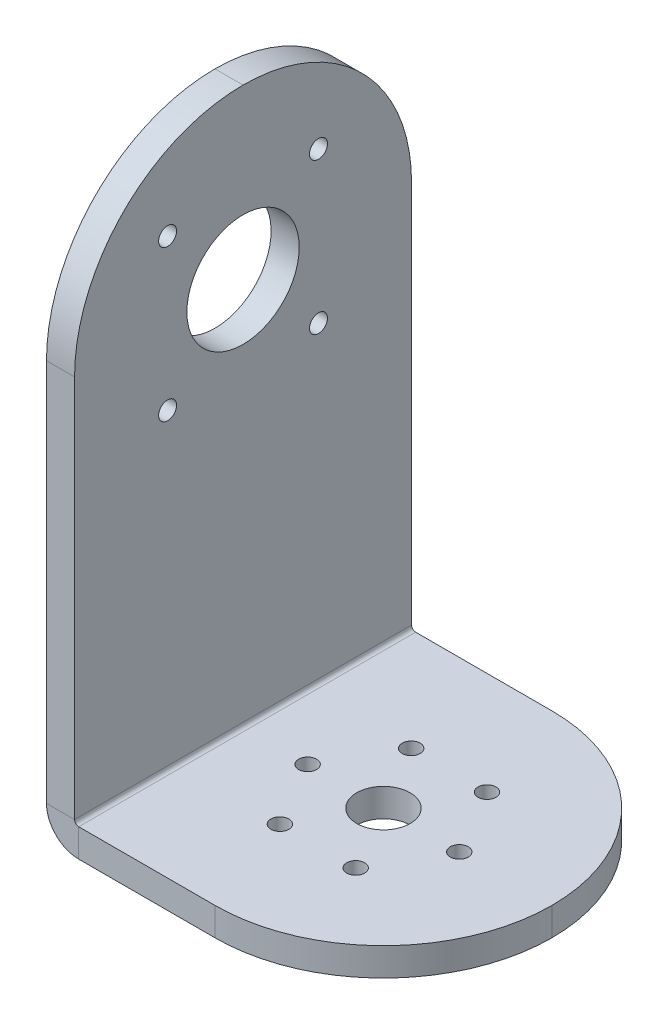
ISO-10303-21;
HEADER;
FILE_DESCRIPTION(('STEP AP214'),'2;1');
FILE_NAME('part.step','',(''),(''),'','','');
FILE_SCHEMA(('AUTOMOTIVE_DESIGN { 1 0 10303 214 1 1 1 1 }'));
ENDSEC;
DATA;
#1=APPLICATION_CONTEXT('core data for automotive mechanical design processes');
#2=APPLICATION_PROTOCOL_DEFINITION('international standard','automotive_design',2000,#1);
#3=PRODUCT_CONTEXT('',#1,'mechanical');
#4=PRODUCT('Part','Part','',(#3));
#5=PRODUCT_RELATED_PRODUCT_CATEGORY('part','',(#4));
#6=PRODUCT_DEFINITION_FORMATION('','',#4);
#7=PRODUCT_DEFINITION_CONTEXT('part definition',#1,'design');
#8=PRODUCT_DEFINITION('design','',#6,#7);
#9=PRODUCT_DEFINITION_SHAPE('','',#8);
#10=(LENGTH_UNIT() NAMED_UNIT(*) SI_UNIT(.MILLI.,.METRE.));
#11=(NAMED_UNIT(*) PLANE_ANGLE_UNIT() SI_UNIT($,.RADIAN.));
#12=(NAMED_UNIT(*) SI_UNIT($,.STERADIAN.) SOLID_ANGLE_UNIT());
#13=UNCERTAINTY_MEASURE_WITH_UNIT(LENGTH_MEASURE(1.E-05),#10,'distance_accuracy_value','');
#14=(GEOMETRIC_REPRESENTATION_CONTEXT(3) GLOBAL_UNCERTAINTY_ASSIGNED_CONTEXT((#13)) GLOBAL_UNIT_ASSIGNED_CONTEXT((#10,
#11,#12)) REPRESENTATION_CONTEXT('',''));
#15=CARTESIAN_POINT('',(0.,0.,0.));
#16=DIRECTION('',(0.,0.,1.));
#17=DIRECTION('',(1.,0.,0.));
#18=AXIS2_PLACEMENT_3D('',#15,#16,#17);
#19=CARTESIAN_POINT('',(0.,104.,30.));
#20=DIRECTION('',(1.,0.,0.));
#21=DIRECTION('',(0.,1.,0.));
#22=AXIS2_PLACEMENT_3D('',#19,#20,#21);
#23=PLANE('',#22);
#24=CARTESIAN_POINT('',(0.,87.4350288425444,-13.4350288425444));
#25=DIRECTION('',(-1.,0.,0.));
#26=DIRECTION('',(0.,0.,1.));
#27=AXIS2_PLACEMENT_3D('',#24,#25,#26);
#28=CIRCLE('',#27,1.60000000000002);
#29=CARTESIAN_POINT('',(0.,87.4350288425444,-11.8350288425444));
#30=VERTEX_POINT('',#29);
#31=EDGE_CURVE('E362',#30,#30,#28,.T.);
#32=ORIENTED_EDGE('',*,*,#31,.F.);
#33=EDGE_LOOP('',(#32));
#34=FACE_BOUND('',#33,.T.);
#35=CARTESIAN_POINT('',(0.,74.,0.));
#36=DIRECTION('',(-1.,0.,0.));
#37=DIRECTION('',(0.,-1.,0.));
#38=AXIS2_PLACEMENT_3D('',#35,#36,#37);
#39=CIRCLE('',#38,10.);
#40=CARTESIAN_POINT('',(0.,64.,0.));
#41=VERTEX_POINT('',#40);
#42=EDGE_CURVE('E383',#41,#41,#39,.T.);
#43=ORIENTED_EDGE('',*,*,#42,.F.);
#44=EDGE_LOOP('',(#43));
#45=FACE_BOUND('',#44,.T.);
#46=CARTESIAN_POINT('',(0.,74.,0.));
#47=DIRECTION('',(1.,0.,0.));
#48=DIRECTION('',(0.,1.,0.));
#49=AXIS2_PLACEMENT_3D('',#46,#47,#48);
#50=CIRCLE('',#49,30.);
#51=CARTESIAN_POINT('',(0.,74.,30.));
#52=VERTEX_POINT('',#51);
#53=CARTESIAN_POINT('',(0.,104.,0.));
#54=VERTEX_POINT('',#53);
#55=EDGE_CURVE('E61',#52,#54,#50,.F.);
#56=ORIENTED_EDGE('',*,*,#55,.T.);
#57=CARTESIAN_POINT('',(0.,74.,0.));
#58=DIRECTION('',(1.,0.,0.));
#59=DIRECTION('',(0.,1.,0.));
#60=AXIS2_PLACEMENT_3D('',#57,#58,#59);
#61=CIRCLE('',#60,30.);
#62=CARTESIAN_POINT('',(0.,74.,-30.));
#63=VERTEX_POINT('',#62);
#64=EDGE_CURVE('E53',#54,#63,#61,.F.);
#65=ORIENTED_EDGE('',*,*,#64,.T.);
#66=DIRECTION('',(0.,-1.,0.));
#67=VECTOR('',#66,1.);
#68=CARTESIAN_POINT('',(0.,104.,-30.));
#69=LINE('',#68,#67);
#70=CARTESIAN_POINT('',(0.,5.73660000000005,-30.));
#71=VERTEX_POINT('',#70);
#72=EDGE_CURVE('E179',#63,#71,#69,.T.);
#73=ORIENTED_EDGE('',*,*,#72,.T.);
#74=DIRECTION('',(0.,0.,-1.));
#75=VECTOR('',#74,1.);
#76=CARTESIAN_POINT('',(0.,5.73660000000005,30.));
#77=LINE('',#76,#75);
#78=CARTESIAN_POINT('',(0.,5.73660000000005,30.));
#79=VERTEX_POINT('',#78);
#80=EDGE_CURVE('E186',#79,#71,#77,.T.);
#81=ORIENTED_EDGE('',*,*,#80,.F.);
#82=DIRECTION('',(0.,-1.,0.));
#83=VECTOR('',#82,1.);
#84=CARTESIAN_POINT('',(0.,104.,30.));
#85=LINE('',#84,#83);
#86=EDGE_CURVE('E163',#52,#79,#85,.T.);
#87=ORIENTED_EDGE('',*,*,#86,.F.);
#88=EDGE_LOOP('',(#56,#65,#73,#81,#87));
#89=FACE_BOUND('',#88,.T.);
#90=CARTESIAN_POINT('',(0.,60.5649711574556,13.4350288425444));
#91=DIRECTION('',(-1.,0.,0.));
#92=DIRECTION('',(0.,0.,1.));
#93=AXIS2_PLACEMENT_3D('',#90,#91,#92);
#94=CIRCLE('',#93,1.60000000000002);
#95=CARTESIAN_POINT('',(0.,60.5649711574556,15.0350288425444));
#96=VERTEX_POINT('',#95);
#97=EDGE_CURVE('E377',#96,#96,#94,.T.);
#98=ORIENTED_EDGE('',*,*,#97,.F.);
#99=EDGE_LOOP('',(#98));
#100=FACE_BOUND('',#99,.T.);
#101=CARTESIAN_POINT('',(0.,60.5649711574556,-13.4350288425444));
#102=DIRECTION('',(-1.,0.,0.));
#103=DIRECTION('',(0.,0.,1.));
#104=AXIS2_PLACEMENT_3D('',#101,#102,#103);
#105=CIRCLE('',#104,1.60000000000002);
#106=CARTESIAN_POINT('',(0.,60.5649711574556,-11.8350288425444));
#107=VERTEX_POINT('',#106);
#108=EDGE_CURVE('E371',#107,#107,#105,.T.);
#109=ORIENTED_EDGE('',*,*,#108,.F.);
#110=EDGE_LOOP('',(#109));
#111=FACE_BOUND('',#110,.T.);
#112=CARTESIAN_POINT('',(0.,87.4350288425444,13.4350288425444));
#113=DIRECTION('',(-1.,0.,0.));
#114=DIRECTION('',(0.,0.,1.));
#115=AXIS2_PLACEMENT_3D('',#112,#113,#114);
#116=CIRCLE('',#115,1.60000000000002);
#117=CARTESIAN_POINT('',(0.,87.4350288425444,15.0350288425444));
#118=VERTEX_POINT('',#117);
#119=EDGE_CURVE('E358',#118,#118,#116,.T.);
#120=ORIENTED_EDGE('',*,*,#119,.F.);
#121=EDGE_LOOP('',(#120));
#122=FACE_BOUND('',#121,.T.);
#123=ADVANCED_FACE('F44',(#34,#45,#89,#100,#111,#122),#23,.F.);
#124=CARTESIAN_POINT('',(0.,5.73660000000005,30.));
#125=DIRECTION('',(0.,0.,1.));
#126=DIRECTION('',(1.,0.,0.));
#127=AXIS2_PLACEMENT_3D('',#124,#125,#126);
#128=PLANE('',#127);
#129=DIRECTION('',(1.,0.,0.));
#130=VECTOR('',#129,1.);
#131=CARTESIAN_POINT('',(0.,5.73660000000005,30.));
#132=LINE('',#131,#130);
#133=CARTESIAN_POINT('',(5.,5.7366,30.));
#134=VERTEX_POINT('',#133);
#135=EDGE_CURVE('E134',#79,#134,#132,.T.);
#136=ORIENTED_EDGE('',*,*,#135,.F.);
#137=CARTESIAN_POINT('',(5.7366,5.7366,30.));
#138=DIRECTION('',(0.,0.,1.));
#139=DIRECTION('',(1.,0.,0.));
#140=AXIS2_PLACEMENT_3D('',#137,#138,#139);
#141=CIRCLE('',#140,5.7366);
#142=CARTESIAN_POINT('',(5.7366,0.,30.));
#143=VERTEX_POINT('',#142);
#144=EDGE_CURVE('E129',#79,#143,#141,.T.);
#145=ORIENTED_EDGE('',*,*,#144,.T.);
#146=DIRECTION('',(0.,-1.,0.));
#147=VECTOR('',#146,1.);
#148=CARTESIAN_POINT('',(5.7366,5.,30.));
#149=LINE('',#148,#147);
#150=CARTESIAN_POINT('',(5.7366,5.,30.));
#151=VERTEX_POINT('',#150);
#152=EDGE_CURVE('E122',#151,#143,#149,.T.);
#153=ORIENTED_EDGE('',*,*,#152,.F.);
#154=CARTESIAN_POINT('',(5.7366,5.7366,30.));
#155=DIRECTION('',(0.,0.,1.));
#156=DIRECTION('',(1.,0.,0.));
#157=AXIS2_PLACEMENT_3D('',#154,#155,#156);
#158=CIRCLE('',#157,0.7366);
#159=EDGE_CURVE('E127',#134,#151,#158,.T.);
#160=ORIENTED_EDGE('',*,*,#159,.F.);
#161=EDGE_LOOP('',(#136,#145,#153,#160));
#162=FACE_BOUND('',#161,.T.);
#163=ADVANCED_FACE('F125',(#162),#128,.T.);
#164=CARTESIAN_POINT('',(5.7366,5.,30.));
#165=DIRECTION('',(0.,0.,1.));
#166=DIRECTION('',(1.,0.,0.));
#167=AXIS2_PLACEMENT_3D('',#164,#165,#166);
#168=PLANE('',#167);
#169=DIRECTION('',(0.,-1.,0.));
#170=VECTOR('',#169,1.);
#171=CARTESIAN_POINT('',(5.,104.,30.));
#172=LINE('',#171,#170);
#173=CARTESIAN_POINT('',(5.,74.,30.));
#174=VERTEX_POINT('',#173);
#175=EDGE_CURVE('E161',#174,#134,#172,.T.);
#176=ORIENTED_EDGE('',*,*,#175,.F.);
#177=DIRECTION('',(1.,0.,0.));
#178=VECTOR('',#177,1.);
#179=CARTESIAN_POINT('',(5.7366,74.,30.));
#180=LINE('',#179,#178);
#181=EDGE_CURVE('E11',#174,#52,#180,.F.);
#182=ORIENTED_EDGE('',*,*,#181,.T.);
#183=ORIENTED_EDGE('',*,*,#86,.T.);
#184=ORIENTED_EDGE('',*,*,#135,.T.);
#185=EDGE_LOOP('',(#176,#182,#183,#184));
#186=FACE_BOUND('',#185,.T.);
#187=ADVANCED_FACE('F256',(#186),#168,.T.);
#188=CARTESIAN_POINT('',(5.7366,0.,-30.));
#189=DIRECTION('',(0.,0.,-1.));
#190=DIRECTION('',(-1.,0.,0.));
#191=AXIS2_PLACEMENT_3D('',#188,#189,#190);
#192=PLANE('',#191);
#193=DIRECTION('',(0.,1.,0.));
#194=VECTOR('',#193,1.);
#195=CARTESIAN_POINT('',(5.7366,0.,-30.));
#196=LINE('',#195,#194);
#197=CARTESIAN_POINT('',(5.7366,0.,-30.));
#198=VERTEX_POINT('',#197);
#199=CARTESIAN_POINT('',(5.7366,5.,-30.));
#200=VERTEX_POINT('',#199);
#201=EDGE_CURVE('E135',#198,#200,#196,.T.);
#202=ORIENTED_EDGE('',*,*,#201,.F.);
#203=CARTESIAN_POINT('',(5.7366,5.7366,-30.));
#204=DIRECTION('',(0.,0.,1.));
#205=DIRECTION('',(1.,0.,0.));
#206=AXIS2_PLACEMENT_3D('',#203,#204,#205);
#207=CIRCLE('',#206,5.7366);
#208=EDGE_CURVE('E181',#71,#198,#207,.T.);
#209=ORIENTED_EDGE('',*,*,#208,.F.);
#210=DIRECTION('',(-1.,0.,0.));
#211=VECTOR('',#210,1.);
#212=CARTESIAN_POINT('',(5.,5.7366,-30.));
#213=LINE('',#212,#211);
#214=CARTESIAN_POINT('',(5.,5.7366,-30.));
#215=VERTEX_POINT('',#214);
#216=EDGE_CURVE('E150',#215,#71,#213,.T.);
#217=ORIENTED_EDGE('',*,*,#216,.F.);
#218=CARTESIAN_POINT('',(5.7366,5.7366,-30.));
#219=DIRECTION('',(0.,0.,1.));
#220=DIRECTION('',(1.,0.,0.));
#221=AXIS2_PLACEMENT_3D('',#218,#219,#220);
#222=CIRCLE('',#221,0.7366);
#223=EDGE_CURVE('E175',#215,#200,#222,.T.);
#224=ORIENTED_EDGE('',*,*,#223,.T.);
#225=EDGE_LOOP('',(#202,#209,#217,#224));
#226=FACE_BOUND('',#225,.T.);
#227=ADVANCED_FACE('F249',(#226),#192,.T.);
#228=CARTESIAN_POINT('',(5.,5.7366,-30.));
#229=DIRECTION('',(0.,0.,-1.));
#230=DIRECTION('',(-1.,0.,0.));
#231=AXIS2_PLACEMENT_3D('',#228,#229,#230);
#232=PLANE('',#231);
#233=DIRECTION('',(1.,0.,0.));
#234=VECTOR('',#233,1.);
#235=CARTESIAN_POINT('',(60.,5.,-30.));
#236=LINE('',#235,#234);
#237=CARTESIAN_POINT('',(30.,5.,-30.));
#238=VERTEX_POINT('',#237);
#239=EDGE_CURVE('E146',#200,#238,#236,.T.);
#240=ORIENTED_EDGE('',*,*,#239,.T.);
#241=DIRECTION('',(0.,-1.,0.));
#242=VECTOR('',#241,1.);
#243=CARTESIAN_POINT('',(30.,5.7366,-30.));
#244=LINE('',#243,#242);
#245=CARTESIAN_POINT('',(30.,0.,-30.));
#246=VERTEX_POINT('',#245);
#247=EDGE_CURVE('E195',#238,#246,#244,.T.);
#248=ORIENTED_EDGE('',*,*,#247,.T.);
#249=DIRECTION('',(1.,0.,0.));
#250=VECTOR('',#249,1.);
#251=CARTESIAN_POINT('',(60.,0.,-30.));
#252=LINE('',#251,#250);
#253=EDGE_CURVE('E170',#198,#246,#252,.T.);
#254=ORIENTED_EDGE('',*,*,#253,.F.);
#255=ORIENTED_EDGE('',*,*,#201,.T.);
#256=EDGE_LOOP('',(#240,#248,#254,#255));
#257=FACE_BOUND('',#256,.T.);
#258=ADVANCED_FACE('F239',(#257),#232,.T.);
#259=CARTESIAN_POINT('',(60.,0.,30.));
#260=DIRECTION('',(0.,1.,0.));
#261=DIRECTION('',(-1.,0.,0.));
#262=AXIS2_PLACEMENT_3D('',#259,#260,#261);
#263=PLANE('',#262);
#264=CARTESIAN_POINT('',(36.75,0.,11.6913429510899));
#265=DIRECTION('',(0.,1.,0.));
#266=DIRECTION('',(-1.,0.,0.));
#267=AXIS2_PLACEMENT_3D('',#264,#265,#266);
#268=CIRCLE('',#267,1.60000000000001);
#269=CARTESIAN_POINT('',(35.15,0.,11.6913429510899));
#270=VERTEX_POINT('',#269);
#271=EDGE_CURVE('E392',#270,#270,#268,.T.);
#272=ORIENTED_EDGE('',*,*,#271,.T.);
#273=EDGE_LOOP('',(#272));
#274=FACE_BOUND('',#273,.T.);
#275=CARTESIAN_POINT('',(43.5,0.,0.));
#276=DIRECTION('',(0.,1.,0.));
#277=DIRECTION('',(-1.,0.,0.));
#278=AXIS2_PLACEMENT_3D('',#275,#276,#277);
#279=CIRCLE('',#278,1.60000000000001);
#280=CARTESIAN_POINT('',(41.9,0.,0.));
#281=VERTEX_POINT('',#280);
#282=EDGE_CURVE('E398',#281,#281,#279,.T.);
#283=ORIENTED_EDGE('',*,*,#282,.T.);
#284=EDGE_LOOP('',(#283));
#285=FACE_BOUND('',#284,.T.);
#286=CARTESIAN_POINT('',(36.75,0.,-11.6913429510899));
#287=DIRECTION('',(0.,1.,0.));
#288=DIRECTION('',(-1.,0.,0.));
#289=AXIS2_PLACEMENT_3D('',#286,#287,#288);
#290=CIRCLE('',#289,1.60000000000001);
#291=CARTESIAN_POINT('',(35.15,0.,-11.6913429510899));
#292=VERTEX_POINT('',#291);
#293=EDGE_CURVE('E404',#292,#292,#290,.T.);
#294=ORIENTED_EDGE('',*,*,#293,.T.);
#295=EDGE_LOOP('',(#294));
#296=FACE_BOUND('',#295,.T.);
#297=CARTESIAN_POINT('',(23.25,0.,-11.6913429510899));
#298=DIRECTION('',(0.,1.,0.));
#299=DIRECTION('',(-1.,0.,0.));
#300=AXIS2_PLACEMENT_3D('',#297,#298,#299);
#301=CIRCLE('',#300,1.60000000000001);
#302=CARTESIAN_POINT('',(21.65,0.,-11.6913429510899));
#303=VERTEX_POINT('',#302);
#304=EDGE_CURVE('E410',#303,#303,#301,.T.);
#305=ORIENTED_EDGE('',*,*,#304,.T.);
#306=EDGE_LOOP('',(#305));
#307=FACE_BOUND('',#306,.T.);
#308=CARTESIAN_POINT('',(16.5,0.,0.));
#309=DIRECTION('',(0.,1.,0.));
#310=DIRECTION('',(-1.,0.,0.));
#311=AXIS2_PLACEMENT_3D('',#308,#309,#310);
#312=CIRCLE('',#311,1.60000000000001);
#313=CARTESIAN_POINT('',(14.9,0.,0.));
#314=VERTEX_POINT('',#313);
#315=EDGE_CURVE('E416',#314,#314,#312,.T.);
#316=ORIENTED_EDGE('',*,*,#315,.T.);
#317=EDGE_LOOP('',(#316));
#318=FACE_BOUND('',#317,.T.);
#319=CARTESIAN_POINT('',(23.25,0.,11.6913429510899));
#320=DIRECTION('',(0.,1.,0.));
#321=DIRECTION('',(-1.,0.,0.));
#322=AXIS2_PLACEMENT_3D('',#319,#320,#321);
#323=CIRCLE('',#322,1.60000000000001);
#324=CARTESIAN_POINT('',(21.65,0.,11.6913429510899));
#325=VERTEX_POINT('',#324);
#326=EDGE_CURVE('E229',#325,#325,#323,.T.);
#327=ORIENTED_EDGE('',*,*,#326,.T.);
#328=EDGE_LOOP('',(#327));
#329=FACE_BOUND('',#328,.T.);
#330=CARTESIAN_POINT('',(30.,0.,0.));
#331=DIRECTION('',(0.,1.,0.));
#332=DIRECTION('',(-1.,0.,0.));
#333=AXIS2_PLACEMENT_3D('',#330,#331,#332);
#334=CIRCLE('',#333,4.75);
#335=CARTESIAN_POINT('',(25.25,0.,0.));
#336=VERTEX_POINT('',#335);
#337=EDGE_CURVE('E220',#336,#336,#334,.T.);
#338=ORIENTED_EDGE('',*,*,#337,.T.);
#339=EDGE_LOOP('',(#338));
#340=FACE_BOUND('',#339,.T.);
#341=ORIENTED_EDGE('',*,*,#253,.T.);
#342=CARTESIAN_POINT('',(30.,0.,0.));
#343=DIRECTION('',(0.,1.,0.));
#344=DIRECTION('',(-1.,0.,0.));
#345=AXIS2_PLACEMENT_3D('',#342,#343,#344);
#346=CIRCLE('',#345,30.);
#347=CARTESIAN_POINT('',(60.,0.,0.));
#348=VERTEX_POINT('',#347);
#349=EDGE_CURVE('E200',#246,#348,#346,.F.);
#350=ORIENTED_EDGE('',*,*,#349,.T.);
#351=CARTESIAN_POINT('',(30.,0.,0.));
#352=DIRECTION('',(0.,1.,0.));
#353=DIRECTION('',(-1.,0.,0.));
#354=AXIS2_PLACEMENT_3D('',#351,#352,#353);
#355=CIRCLE('',#354,30.);
#356=CARTESIAN_POINT('',(30.,0.,30.));
#357=VERTEX_POINT('',#356);
#358=EDGE_CURVE('E198',#348,#357,#355,.F.);
#359=ORIENTED_EDGE('',*,*,#358,.T.);
#360=DIRECTION('',(1.,0.,0.));
#361=VECTOR('',#360,1.);
#362=CARTESIAN_POINT('',(60.,0.,30.));
#363=LINE('',#362,#361);
#364=EDGE_CURVE('E156',#143,#357,#363,.T.);
#365=ORIENTED_EDGE('',*,*,#364,.F.);
#366=DIRECTION('',(0.,0.,-1.));
#367=VECTOR('',#366,1.);
#368=CARTESIAN_POINT('',(5.7366,0.,30.));
#369=LINE('',#368,#367);
#370=EDGE_CURVE('E169',#143,#198,#369,.T.);
#371=ORIENTED_EDGE('',*,*,#370,.T.);
#372=EDGE_LOOP('',(#341,#350,#359,#365,#371));
#373=FACE_BOUND('',#372,.T.);
#374=ADVANCED_FACE('F242',(#274,#285,#296,#307,#318,#329,#340,#373),#263,.F.);
#375=CARTESIAN_POINT('',(60.,5.,30.));
#376=DIRECTION('',(0.,1.,0.));
#377=DIRECTION('',(-1.,0.,0.));
#378=AXIS2_PLACEMENT_3D('',#375,#376,#377);
#379=PLANE('',#378);
#380=CARTESIAN_POINT('',(36.75,5.,11.6913429510899));
#381=DIRECTION('',(0.,1.,0.));
#382=DIRECTION('',(0.,0.,1.));
#383=AXIS2_PLACEMENT_3D('',#380,#381,#382);
#384=CIRCLE('',#383,1.60000000000001);
#385=CARTESIAN_POINT('',(36.75,5.,13.2913429510899));
#386=VERTEX_POINT('',#385);
#387=EDGE_CURVE('E389',#386,#386,#384,.T.);
#388=ORIENTED_EDGE('',*,*,#387,.F.);
#389=EDGE_LOOP('',(#388));
#390=FACE_BOUND('',#389,.T.);
#391=CARTESIAN_POINT('',(43.5,5.,0.));
#392=DIRECTION('',(0.,1.,0.));
#393=DIRECTION('',(0.,0.,1.));
#394=AXIS2_PLACEMENT_3D('',#391,#392,#393);
#395=CIRCLE('',#394,1.60000000000002);
#396=CARTESIAN_POINT('',(43.5,5.,1.60000000000003));
#397=VERTEX_POINT('',#396);
#398=EDGE_CURVE('E395',#397,#397,#395,.T.);
#399=ORIENTED_EDGE('',*,*,#398,.F.);
#400=EDGE_LOOP('',(#399));
#401=FACE_BOUND('',#400,.T.);
#402=CARTESIAN_POINT('',(36.75,5.,-11.6913429510899));
#403=DIRECTION('',(0.,1.,0.));
#404=DIRECTION('',(0.,0.,1.));
#405=AXIS2_PLACEMENT_3D('',#402,#403,#404);
#406=CIRCLE('',#405,1.60000000000002);
#407=CARTESIAN_POINT('',(36.75,5.,-10.0913429510899));
#408=VERTEX_POINT('',#407);
#409=EDGE_CURVE('E401',#408,#408,#406,.T.);
#410=ORIENTED_EDGE('',*,*,#409,.F.);
#411=EDGE_LOOP('',(#410));
#412=FACE_BOUND('',#411,.T.);
#413=CARTESIAN_POINT('',(23.25,5.,-11.6913429510899));
#414=DIRECTION('',(0.,1.,0.));
#415=DIRECTION('',(0.,0.,1.));
#416=AXIS2_PLACEMENT_3D('',#413,#414,#415);
#417=CIRCLE('',#416,1.60000000000001);
#418=CARTESIAN_POINT('',(23.25,5.,-10.0913429510899));
#419=VERTEX_POINT('',#418);
#420=EDGE_CURVE('E407',#419,#419,#417,.T.);
#421=ORIENTED_EDGE('',*,*,#420,.F.);
#422=EDGE_LOOP('',(#421));
#423=FACE_BOUND('',#422,.T.);
#424=CARTESIAN_POINT('',(16.5,5.,0.));
#425=DIRECTION('',(0.,1.,0.));
#426=DIRECTION('',(0.,0.,1.));
#427=AXIS2_PLACEMENT_3D('',#424,#425,#426);
#428=CIRCLE('',#427,1.60000000000001);
#429=CARTESIAN_POINT('',(16.5,5.,1.60000000000001));
#430=VERTEX_POINT('',#429);
#431=EDGE_CURVE('E413',#430,#430,#428,.T.);
#432=ORIENTED_EDGE('',*,*,#431,.F.);
#433=EDGE_LOOP('',(#432));
#434=FACE_BOUND('',#433,.T.);
#435=CARTESIAN_POINT('',(23.25,5.,11.6913429510899));
#436=DIRECTION('',(0.,1.,0.));
#437=DIRECTION('',(0.,0.,1.));
#438=AXIS2_PLACEMENT_3D('',#435,#436,#437);
#439=CIRCLE('',#438,1.60000000000001);
#440=CARTESIAN_POINT('',(23.25,5.,13.2913429510899));
#441=VERTEX_POINT('',#440);
#442=EDGE_CURVE('E419',#441,#441,#439,.T.);
#443=ORIENTED_EDGE('',*,*,#442,.F.);
#444=EDGE_LOOP('',(#443));
#445=FACE_BOUND('',#444,.T.);
#446=CARTESIAN_POINT('',(30.,5.,0.));
#447=DIRECTION('',(0.,1.,0.));
#448=DIRECTION('',(-1.,0.,0.));
#449=AXIS2_PLACEMENT_3D('',#446,#447,#448);
#450=CIRCLE('',#449,4.75);
#451=CARTESIAN_POINT('',(25.25,5.,0.));
#452=VERTEX_POINT('',#451);
#453=EDGE_CURVE('E224',#452,#452,#450,.T.);
#454=ORIENTED_EDGE('',*,*,#453,.F.);
#455=EDGE_LOOP('',(#454));
#456=FACE_BOUND('',#455,.T.);
#457=CARTESIAN_POINT('',(30.,5.,0.));
#458=DIRECTION('',(0.,1.,0.));
#459=DIRECTION('',(-1.,0.,0.));
#460=AXIS2_PLACEMENT_3D('',#457,#458,#459);
#461=CIRCLE('',#460,30.);
#462=CARTESIAN_POINT('',(30.,5.,30.));
#463=VERTEX_POINT('',#462);
#464=CARTESIAN_POINT('',(60.,5.,0.));
#465=VERTEX_POINT('',#464);
#466=EDGE_CURVE('E202',#463,#465,#461,.T.);
#467=ORIENTED_EDGE('',*,*,#466,.T.);
#468=CARTESIAN_POINT('',(30.,5.,0.));
#469=DIRECTION('',(0.,1.,0.));
#470=DIRECTION('',(-1.,0.,0.));
#471=AXIS2_PLACEMENT_3D('',#468,#469,#470);
#472=CIRCLE('',#471,30.);
#473=EDGE_CURVE('E204',#465,#238,#472,.T.);
#474=ORIENTED_EDGE('',*,*,#473,.T.);
#475=ORIENTED_EDGE('',*,*,#239,.F.);
#476=DIRECTION('',(0.,0.,-1.));
#477=VECTOR('',#476,1.);
#478=CARTESIAN_POINT('',(5.7366,5.,30.));
#479=LINE('',#478,#477);
#480=EDGE_CURVE('E141',#151,#200,#479,.T.);
#481=ORIENTED_EDGE('',*,*,#480,.F.);
#482=DIRECTION('',(1.,0.,0.));
#483=VECTOR('',#482,1.);
#484=CARTESIAN_POINT('',(60.,5.,30.));
#485=LINE('',#484,#483);
#486=EDGE_CURVE('E143',#151,#463,#485,.T.);
#487=ORIENTED_EDGE('',*,*,#486,.T.);
#488=EDGE_LOOP('',(#467,#474,#475,#481,#487));
#489=FACE_BOUND('',#488,.T.);
#490=ADVANCED_FACE('F142',(#390,#401,#412,#423,#434,#445,#456,#489),#379,.T.);
#491=CARTESIAN_POINT('',(5.7366,5.7366,30.));
#492=DIRECTION('',(0.,0.,-1.));
#493=DIRECTION('',(-1.,0.,0.));
#494=AXIS2_PLACEMENT_3D('',#491,#492,#493);
#495=CYLINDRICAL_SURFACE('',#494,0.7366);
#496=ORIENTED_EDGE('',*,*,#223,.F.);
#497=DIRECTION('',(0.,0.,-1.));
#498=VECTOR('',#497,1.);
#499=CARTESIAN_POINT('',(5.,5.7366,30.));
#500=LINE('',#499,#498);
#501=EDGE_CURVE('E151',#134,#215,#500,.T.);
#502=ORIENTED_EDGE('',*,*,#501,.F.);
#503=ORIENTED_EDGE('',*,*,#159,.T.);
#504=ORIENTED_EDGE('',*,*,#480,.T.);
#505=EDGE_LOOP('',(#496,#502,#503,#504));
#506=FACE_BOUND('',#505,.T.);
#507=ADVANCED_FACE('F159',(#506),#495,.F.);
#508=CARTESIAN_POINT('',(5.,104.,30.));
#509=DIRECTION('',(1.,0.,0.));
#510=DIRECTION('',(0.,1.,0.));
#511=AXIS2_PLACEMENT_3D('',#508,#509,#510);
#512=PLANE('',#511);
#513=CARTESIAN_POINT('',(5.,87.4350288425444,13.4350288425444));
#514=DIRECTION('',(1.,0.,0.));
#515=DIRECTION('',(0.,1.,0.));
#516=AXIS2_PLACEMENT_3D('',#513,#514,#515);
#517=CIRCLE('',#516,1.60000000000002);
#518=CARTESIAN_POINT('',(5.,89.0350288425444,13.4350288425444));
#519=VERTEX_POINT('',#518);
#520=EDGE_CURVE('E361',#519,#519,#517,.T.);
#521=ORIENTED_EDGE('',*,*,#520,.F.);
#522=EDGE_LOOP('',(#521));
#523=FACE_BOUND('',#522,.T.);
#524=CARTESIAN_POINT('',(5.,87.4350288425444,-13.4350288425444));
#525=DIRECTION('',(1.,0.,0.));
#526=DIRECTION('',(0.,1.,0.));
#527=AXIS2_PLACEMENT_3D('',#524,#525,#526);
#528=CIRCLE('',#527,1.60000000000002);
#529=CARTESIAN_POINT('',(5.,89.0350288425444,-13.4350288425444));
#530=VERTEX_POINT('',#529);
#531=EDGE_CURVE('E365',#530,#530,#528,.T.);
#532=ORIENTED_EDGE('',*,*,#531,.F.);
#533=EDGE_LOOP('',(#532));
#534=FACE_BOUND('',#533,.T.);
#535=CARTESIAN_POINT('',(5.,60.5649711574556,-13.4350288425444));
#536=DIRECTION('',(1.,0.,0.));
#537=DIRECTION('',(0.,1.,0.));
#538=AXIS2_PLACEMENT_3D('',#535,#536,#537);
#539=CIRCLE('',#538,1.60000000000001);
#540=CARTESIAN_POINT('',(5.,62.1649711574556,-13.4350288425444));
#541=VERTEX_POINT('',#540);
#542=EDGE_CURVE('E374',#541,#541,#539,.T.);
#543=ORIENTED_EDGE('',*,*,#542,.F.);
#544=EDGE_LOOP('',(#543));
#545=FACE_BOUND('',#544,.T.);
#546=CARTESIAN_POINT('',(5.,60.5649711574556,13.4350288425444));
#547=DIRECTION('',(1.,0.,0.));
#548=DIRECTION('',(0.,1.,0.));
#549=AXIS2_PLACEMENT_3D('',#546,#547,#548);
#550=CIRCLE('',#549,1.60000000000001);
#551=CARTESIAN_POINT('',(5.,62.1649711574556,13.4350288425444));
#552=VERTEX_POINT('',#551);
#553=EDGE_CURVE('E380',#552,#552,#550,.T.);
#554=ORIENTED_EDGE('',*,*,#553,.F.);
#555=EDGE_LOOP('',(#554));
#556=FACE_BOUND('',#555,.T.);
#557=CARTESIAN_POINT('',(5.,74.,0.));
#558=DIRECTION('',(1.,0.,0.));
#559=DIRECTION('',(0.,1.,0.));
#560=AXIS2_PLACEMENT_3D('',#557,#558,#559);
#561=CIRCLE('',#560,10.);
#562=CARTESIAN_POINT('',(5.,84.,0.));
#563=VERTEX_POINT('',#562);
#564=EDGE_CURVE('E386',#563,#563,#561,.T.);
#565=ORIENTED_EDGE('',*,*,#564,.F.);
#566=EDGE_LOOP('',(#565));
#567=FACE_BOUND('',#566,.T.);
#568=DIRECTION('',(0.,-1.,0.));
#569=VECTOR('',#568,1.);
#570=CARTESIAN_POINT('',(5.,104.,-30.));
#571=LINE('',#570,#569);
#572=CARTESIAN_POINT('',(5.,74.,-30.));
#573=VERTEX_POINT('',#572);
#574=EDGE_CURVE('E177',#573,#215,#571,.T.);
#575=ORIENTED_EDGE('',*,*,#574,.F.);
#576=CARTESIAN_POINT('',(5.,74.,0.));
#577=DIRECTION('',(1.,0.,0.));
#578=DIRECTION('',(0.,1.,0.));
#579=AXIS2_PLACEMENT_3D('',#576,#577,#578);
#580=CIRCLE('',#579,30.);
#581=CARTESIAN_POINT('',(5.,104.,0.));
#582=VERTEX_POINT('',#581);
#583=EDGE_CURVE('E212',#573,#582,#580,.T.);
#584=ORIENTED_EDGE('',*,*,#583,.T.);
#585=CARTESIAN_POINT('',(5.,74.,0.));
#586=DIRECTION('',(1.,0.,0.));
#587=DIRECTION('',(0.,1.,0.));
#588=AXIS2_PLACEMENT_3D('',#585,#586,#587);
#589=CIRCLE('',#588,30.);
#590=EDGE_CURVE('E210',#582,#174,#589,.T.);
#591=ORIENTED_EDGE('',*,*,#590,.T.);
#592=ORIENTED_EDGE('',*,*,#175,.T.);
#593=ORIENTED_EDGE('',*,*,#501,.T.);
#594=EDGE_LOOP('',(#575,#584,#591,#592,#593));
#595=FACE_BOUND('',#594,.T.);
#596=ADVANCED_FACE('F254',(#523,#534,#545,#556,#567,#595),#512,.T.);
#597=CARTESIAN_POINT('',(5.7366,5.7366,30.));
#598=DIRECTION('',(0.,0.,-1.));
#599=DIRECTION('',(-1.,0.,0.));
#600=AXIS2_PLACEMENT_3D('',#597,#598,#599);
#601=CYLINDRICAL_SURFACE('',#600,5.7366);
#602=ORIENTED_EDGE('',*,*,#208,.T.);
#603=ORIENTED_EDGE('',*,*,#370,.F.);
#604=ORIENTED_EDGE('',*,*,#144,.F.);
#605=ORIENTED_EDGE('',*,*,#80,.T.);
#606=EDGE_LOOP('',(#602,#603,#604,#605));
#607=FACE_BOUND('',#606,.T.);
#608=ADVANCED_FACE('F244',(#607),#601,.T.);
#609=CARTESIAN_POINT('',(5.7366,5.7366,30.));
#610=DIRECTION('',(0.,0.,1.));
#611=DIRECTION('',(1.,0.,0.));
#612=AXIS2_PLACEMENT_3D('',#609,#610,#611);
#613=PLANE('',#612);
#614=ORIENTED_EDGE('',*,*,#364,.T.);
#615=DIRECTION('',(0.,-1.,0.));
#616=VECTOR('',#615,1.);
#617=CARTESIAN_POINT('',(30.,5.7366,30.));
#618=LINE('',#617,#616);
#619=EDGE_CURVE('E155',#357,#463,#618,.F.);
#620=ORIENTED_EDGE('',*,*,#619,.T.);
#621=ORIENTED_EDGE('',*,*,#486,.F.);
#622=ORIENTED_EDGE('',*,*,#152,.T.);
#623=EDGE_LOOP('',(#614,#620,#621,#622));
#624=FACE_BOUND('',#623,.T.);
#625=ADVANCED_FACE('F153',(#624),#613,.T.);
#626=CARTESIAN_POINT('',(5.7366,5.7366,-30.));
#627=DIRECTION('',(0.,0.,1.));
#628=DIRECTION('',(1.,0.,0.));
#629=AXIS2_PLACEMENT_3D('',#626,#627,#628);
#630=PLANE('',#629);
#631=ORIENTED_EDGE('',*,*,#72,.F.);
#632=DIRECTION('',(1.,0.,0.));
#633=VECTOR('',#632,1.);
#634=CARTESIAN_POINT('',(5.,74.,-30.));
#635=LINE('',#634,#633);
#636=EDGE_CURVE('E207',#63,#573,#635,.T.);
#637=ORIENTED_EDGE('',*,*,#636,.T.);
#638=ORIENTED_EDGE('',*,*,#574,.T.);
#639=ORIENTED_EDGE('',*,*,#216,.T.);
#640=EDGE_LOOP('',(#631,#637,#638,#639));
#641=FACE_BOUND('',#640,.T.);
#642=ADVANCED_FACE('F259',(#641),#630,.F.);
#643=CARTESIAN_POINT('',(30.,5.,0.));
#644=DIRECTION('',(0.,-1.,0.));
#645=DIRECTION('',(0.,0.,-1.));
#646=AXIS2_PLACEMENT_3D('',#643,#644,#645);
#647=CYLINDRICAL_SURFACE('',#646,30.);
#648=DIRECTION('',(0.,-1.,0.));
#649=VECTOR('',#648,1.);
#650=CARTESIAN_POINT('',(60.,5.,0.));
#651=LINE('',#650,#649);
#652=EDGE_CURVE('E173',#465,#348,#651,.T.);
#653=ORIENTED_EDGE('',*,*,#652,.F.);
#654=ORIENTED_EDGE('',*,*,#466,.F.);
#655=ORIENTED_EDGE('',*,*,#619,.F.);
#656=ORIENTED_EDGE('',*,*,#358,.F.);
#657=EDGE_LOOP('',(#653,#654,#655,#656));
#658=FACE_BOUND('',#657,.T.);
#659=ADVANCED_FACE('F236',(#658),#647,.T.);
#660=CARTESIAN_POINT('',(30.,5.7366,0.));
#661=DIRECTION('',(0.,-1.,0.));
#662=DIRECTION('',(0.,0.,-1.));
#663=AXIS2_PLACEMENT_3D('',#660,#661,#662);
#664=CYLINDRICAL_SURFACE('',#663,30.);
#665=ORIENTED_EDGE('',*,*,#473,.F.);
#666=ORIENTED_EDGE('',*,*,#652,.T.);
#667=ORIENTED_EDGE('',*,*,#349,.F.);
#668=ORIENTED_EDGE('',*,*,#247,.F.);
#669=EDGE_LOOP('',(#665,#666,#667,#668));
#670=FACE_BOUND('',#669,.T.);
#671=ADVANCED_FACE('F241',(#670),#664,.T.);
#672=CARTESIAN_POINT('',(0.,74.,0.));
#673=DIRECTION('',(1.,0.,0.));
#674=DIRECTION('',(0.,0.,-1.));
#675=AXIS2_PLACEMENT_3D('',#672,#673,#674);
#676=CYLINDRICAL_SURFACE('',#675,30.);
#677=DIRECTION('',(1.,0.,0.));
#678=VECTOR('',#677,1.);
#679=CARTESIAN_POINT('',(0.,104.,0.));
#680=LINE('',#679,#678);
#681=EDGE_CURVE('E48',#54,#582,#680,.T.);
#682=ORIENTED_EDGE('',*,*,#681,.F.);
#683=ORIENTED_EDGE('',*,*,#55,.F.);
#684=ORIENTED_EDGE('',*,*,#181,.F.);
#685=ORIENTED_EDGE('',*,*,#590,.F.);
#686=EDGE_LOOP('',(#682,#683,#684,#685));
#687=FACE_BOUND('',#686,.T.);
#688=ADVANCED_FACE('F46',(#687),#676,.T.);
#689=CARTESIAN_POINT('',(5.7366,74.,0.));
#690=DIRECTION('',(-1.,0.,0.));
#691=DIRECTION('',(0.,0.,1.));
#692=AXIS2_PLACEMENT_3D('',#689,#690,#691);
#693=CYLINDRICAL_SURFACE('',#692,30.);
#694=ORIENTED_EDGE('',*,*,#64,.F.);
#695=ORIENTED_EDGE('',*,*,#681,.T.);
#696=ORIENTED_EDGE('',*,*,#583,.F.);
#697=ORIENTED_EDGE('',*,*,#636,.F.);
#698=EDGE_LOOP('',(#694,#695,#696,#697));
#699=FACE_BOUND('',#698,.T.);
#700=ADVANCED_FACE('F260',(#699),#693,.T.);
#701=CARTESIAN_POINT('',(30.,-5.,0.));
#702=DIRECTION('',(0.,1.,0.));
#703=DIRECTION('',(-1.,0.,0.));
#704=AXIS2_PLACEMENT_3D('',#701,#702,#703);
#705=CYLINDRICAL_SURFACE('',#704,4.75);
#706=ORIENTED_EDGE('',*,*,#453,.T.);
#707=EDGE_LOOP('',(#706));
#708=FACE_BOUND('',#707,.T.);
#709=ORIENTED_EDGE('',*,*,#337,.F.);
#710=EDGE_LOOP('',(#709));
#711=FACE_BOUND('',#710,.T.);
#712=ADVANCED_FACE('F267',(#708,#711),#705,.F.);
#713=CARTESIAN_POINT('',(23.25,5.,11.6913429510899));
#714=DIRECTION('',(0.,1.,0.));
#715=DIRECTION('',(0.,0.,1.));
#716=AXIS2_PLACEMENT_3D('',#713,#714,#715);
#717=CYLINDRICAL_SURFACE('',#716,1.60000000000001);
#718=ORIENTED_EDGE('',*,*,#326,.F.);
#719=EDGE_LOOP('',(#718));
#720=FACE_BOUND('',#719,.T.);
#721=ORIENTED_EDGE('',*,*,#442,.T.);
#722=EDGE_LOOP('',(#721));
#723=FACE_BOUND('',#722,.T.);
#724=ADVANCED_FACE('F310',(#720,#723),#717,.F.);
#725=CARTESIAN_POINT('',(16.5,5.,0.));
#726=DIRECTION('',(0.,1.,0.));
#727=DIRECTION('',(0.,0.,1.));
#728=AXIS2_PLACEMENT_3D('',#725,#726,#727);
#729=CYLINDRICAL_SURFACE('',#728,1.60000000000001);
#730=ORIENTED_EDGE('',*,*,#315,.F.);
#731=EDGE_LOOP('',(#730));
#732=FACE_BOUND('',#731,.T.);
#733=ORIENTED_EDGE('',*,*,#431,.T.);
#734=EDGE_LOOP('',(#733));
#735=FACE_BOUND('',#734,.T.);
#736=ADVANCED_FACE('F314',(#732,#735),#729,.F.);
#737=CARTESIAN_POINT('',(23.25,5.,-11.6913429510899));
#738=DIRECTION('',(0.,1.,0.));
#739=DIRECTION('',(0.,0.,1.));
#740=AXIS2_PLACEMENT_3D('',#737,#738,#739);
#741=CYLINDRICAL_SURFACE('',#740,1.60000000000001);
#742=ORIENTED_EDGE('',*,*,#304,.F.);
#743=EDGE_LOOP('',(#742));
#744=FACE_BOUND('',#743,.T.);
#745=ORIENTED_EDGE('',*,*,#420,.T.);
#746=EDGE_LOOP('',(#745));
#747=FACE_BOUND('',#746,.T.);
#748=ADVANCED_FACE('F318',(#744,#747),#741,.F.);
#749=CARTESIAN_POINT('',(36.75,5.,-11.6913429510899));
#750=DIRECTION('',(0.,1.,0.));
#751=DIRECTION('',(0.,0.,1.));
#752=AXIS2_PLACEMENT_3D('',#749,#750,#751);
#753=CYLINDRICAL_SURFACE('',#752,1.60000000000001);
#754=ORIENTED_EDGE('',*,*,#293,.F.);
#755=EDGE_LOOP('',(#754));
#756=FACE_BOUND('',#755,.T.);
#757=ORIENTED_EDGE('',*,*,#409,.T.);
#758=EDGE_LOOP('',(#757));
#759=FACE_BOUND('',#758,.T.);
#760=ADVANCED_FACE('F322',(#756,#759),#753,.F.);
#761=CARTESIAN_POINT('',(43.5,5.,0.));
#762=DIRECTION('',(0.,1.,0.));
#763=DIRECTION('',(0.,0.,1.));
#764=AXIS2_PLACEMENT_3D('',#761,#762,#763);
#765=CYLINDRICAL_SURFACE('',#764,1.60000000000001);
#766=ORIENTED_EDGE('',*,*,#282,.F.);
#767=EDGE_LOOP('',(#766));
#768=FACE_BOUND('',#767,.T.);
#769=ORIENTED_EDGE('',*,*,#398,.T.);
#770=EDGE_LOOP('',(#769));
#771=FACE_BOUND('',#770,.T.);
#772=ADVANCED_FACE('F326',(#768,#771),#765,.F.);
#773=CARTESIAN_POINT('',(36.75,5.,11.6913429510899));
#774=DIRECTION('',(0.,1.,0.));
#775=DIRECTION('',(0.,0.,1.));
#776=AXIS2_PLACEMENT_3D('',#773,#774,#775);
#777=CYLINDRICAL_SURFACE('',#776,1.60000000000001);
#778=ORIENTED_EDGE('',*,*,#271,.F.);
#779=EDGE_LOOP('',(#778));
#780=FACE_BOUND('',#779,.T.);
#781=ORIENTED_EDGE('',*,*,#387,.T.);
#782=EDGE_LOOP('',(#781));
#783=FACE_BOUND('',#782,.T.);
#784=ADVANCED_FACE('F330',(#780,#783),#777,.F.);
#785=CARTESIAN_POINT('',(9.99999999999999,74.,0.));
#786=DIRECTION('',(-1.,0.,0.));
#787=DIRECTION('',(0.,-1.,0.));
#788=AXIS2_PLACEMENT_3D('',#785,#786,#787);
#789=CYLINDRICAL_SURFACE('',#788,10.);
#790=ORIENTED_EDGE('',*,*,#564,.T.);
#791=EDGE_LOOP('',(#790));
#792=FACE_BOUND('',#791,.T.);
#793=ORIENTED_EDGE('',*,*,#42,.T.);
#794=EDGE_LOOP('',(#793));
#795=FACE_BOUND('',#794,.T.);
#796=ADVANCED_FACE('F334',(#792,#795),#789,.F.);
#797=CARTESIAN_POINT('',(0.,60.5649711574556,13.4350288425444));
#798=DIRECTION('',(-1.,0.,0.));
#799=DIRECTION('',(0.,0.,1.));
#800=AXIS2_PLACEMENT_3D('',#797,#798,#799);
#801=CYLINDRICAL_SURFACE('',#800,1.60000000000001);
#802=ORIENTED_EDGE('',*,*,#97,.T.);
#803=EDGE_LOOP('',(#802));
#804=FACE_BOUND('',#803,.T.);
#805=ORIENTED_EDGE('',*,*,#553,.T.);
#806=EDGE_LOOP('',(#805));
#807=FACE_BOUND('',#806,.T.);
#808=ADVANCED_FACE('F337',(#804,#807),#801,.F.);
#809=CARTESIAN_POINT('',(0.,60.5649711574556,-13.4350288425444));
#810=DIRECTION('',(-1.,0.,0.));
#811=DIRECTION('',(0.,0.,1.));
#812=AXIS2_PLACEMENT_3D('',#809,#810,#811);
#813=CYLINDRICAL_SURFACE('',#812,1.60000000000001);
#814=ORIENTED_EDGE('',*,*,#108,.T.);
#815=EDGE_LOOP('',(#814));
#816=FACE_BOUND('',#815,.T.);
#817=ORIENTED_EDGE('',*,*,#542,.T.);
#818=EDGE_LOOP('',(#817));
#819=FACE_BOUND('',#818,.T.);
#820=ADVANCED_FACE('F341',(#816,#819),#813,.F.);
#821=CARTESIAN_POINT('',(0.,87.4350288425444,-13.4350288425444));
#822=DIRECTION('',(-1.,0.,0.));
#823=DIRECTION('',(0.,0.,1.));
#824=AXIS2_PLACEMENT_3D('',#821,#822,#823);
#825=CYLINDRICAL_SURFACE('',#824,1.60000000000002);
#826=ORIENTED_EDGE('',*,*,#31,.T.);
#827=EDGE_LOOP('',(#826));
#828=FACE_BOUND('',#827,.T.);
#829=ORIENTED_EDGE('',*,*,#531,.T.);
#830=EDGE_LOOP('',(#829));
#831=FACE_BOUND('',#830,.T.);
#832=ADVANCED_FACE('F345',(#828,#831),#825,.F.);
#833=CARTESIAN_POINT('',(0.,87.4350288425444,13.4350288425444));
#834=DIRECTION('',(-1.,0.,0.));
#835=DIRECTION('',(0.,0.,1.));
#836=AXIS2_PLACEMENT_3D('',#833,#834,#835);
#837=CYLINDRICAL_SURFACE('',#836,1.60000000000002);
#838=ORIENTED_EDGE('',*,*,#119,.T.);
#839=EDGE_LOOP('',(#838));
#840=FACE_BOUND('',#839,.T.);
#841=ORIENTED_EDGE('',*,*,#520,.T.);
#842=EDGE_LOOP('',(#841));
#843=FACE_BOUND('',#842,.T.);
#844=ADVANCED_FACE('F349',(#840,#843),#837,.F.);
#845=CLOSED_SHELL('',(#123,#163,#187,#227,#258,#374,#490,#507,#596,#608,#625,#642,#659,#671,
#688,#700,#712,#724,#736,#748,#760,#772,#784,#796,#808,#820,#832,#844));
#846=MANIFOLD_SOLID_BREP('B2',#845);
#847=ADVANCED_BREP_SHAPE_REPRESENTATION('',(#18,#846),#14);
#848=SHAPE_DEFINITION_REPRESENTATION(#9,#847);
ENDSEC;
END-ISO-10303-21;
